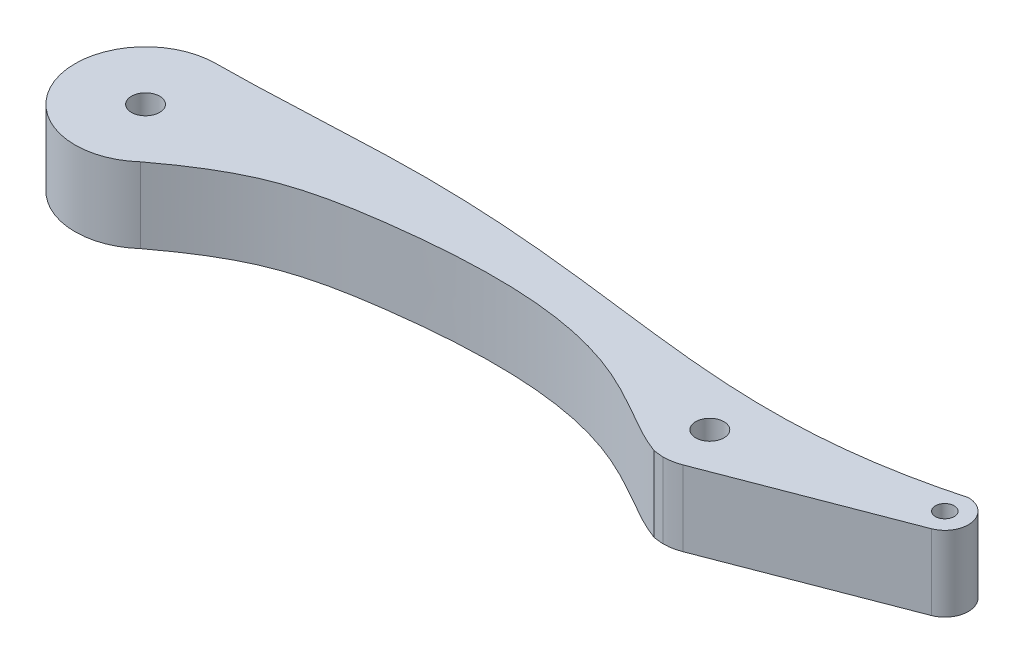
ISO-10303-21;
HEADER;
FILE_DESCRIPTION(('STEP AP214'),'2;1');
FILE_NAME('part.step','',(''),(''),'','','');
FILE_SCHEMA(('AUTOMOTIVE_DESIGN { 1 0 10303 214 1 1 1 1 }'));
ENDSEC;
DATA;
#1=APPLICATION_CONTEXT('core data for automotive mechanical design processes');
#2=APPLICATION_PROTOCOL_DEFINITION('international standard','automotive_design',2000,#1);
#3=PRODUCT_CONTEXT('',#1,'mechanical');
#4=PRODUCT('Part','Part','',(#3));
#5=PRODUCT_RELATED_PRODUCT_CATEGORY('part','',(#4));
#6=PRODUCT_DEFINITION_FORMATION('','',#4);
#7=PRODUCT_DEFINITION_CONTEXT('part definition',#1,'design');
#8=PRODUCT_DEFINITION('design','',#6,#7);
#9=PRODUCT_DEFINITION_SHAPE('','',#8);
#10=(LENGTH_UNIT() NAMED_UNIT(*) SI_UNIT(.MILLI.,.METRE.));
#11=(NAMED_UNIT(*) PLANE_ANGLE_UNIT() SI_UNIT($,.RADIAN.));
#12=(NAMED_UNIT(*) SI_UNIT($,.STERADIAN.) SOLID_ANGLE_UNIT());
#13=UNCERTAINTY_MEASURE_WITH_UNIT(LENGTH_MEASURE(1.E-05),#10,'distance_accuracy_value','');
#14=(GEOMETRIC_REPRESENTATION_CONTEXT(3) GLOBAL_UNCERTAINTY_ASSIGNED_CONTEXT((#13)) GLOBAL_UNIT_ASSIGNED_CONTEXT((#10,
#11,#12)) REPRESENTATION_CONTEXT('',''));
#15=CARTESIAN_POINT('',(0.,0.,0.));
#16=DIRECTION('',(0.,0.,1.));
#17=DIRECTION('',(1.,0.,0.));
#18=AXIS2_PLACEMENT_3D('',#15,#16,#17);
#19=CARTESIAN_POINT('',(0.,8.,-7.5));
#20=CARTESIAN_POINT('',(6.59618739379903,8.,-7.53042618499185));
#21=CARTESIAN_POINT('',(41.0181532042921,8.,-10.2662820268828));
#22=CARTESIAN_POINT('',(57.4957136227641,8.,-1.43169155879023));
#23=CARTESIAN_POINT('',(79.9999926350941,8.,-7.52972858327825));
#24=B_SPLINE_CURVE_WITH_KNOTS('',3,(#19,#20,#21,#22,#23),.UNSPECIFIED.,.F.,.F.,(4,1,4),(0.,
0.213970645101802,1.),.UNSPECIFIED.);
#25=DIRECTION('',(0.,-1.,0.));
#26=VECTOR('',#25,1.);
#27=SURFACE_OF_LINEAR_EXTRUSION('',#24,#26);
#28=CARTESIAN_POINT('',(0.,0.,-7.5));
#29=CARTESIAN_POINT('',(6.59618739379903,0.,-7.53042618499185));
#30=CARTESIAN_POINT('',(41.0181532042921,0.,-10.2662820268828));
#31=CARTESIAN_POINT('',(57.4957136227641,0.,-1.43169155879023));
#32=CARTESIAN_POINT('',(79.9999926350941,0.,-7.52972858327825));
#33=B_SPLINE_CURVE_WITH_KNOTS('',3,(#28,#29,#30,#31,#32),.UNSPECIFIED.,.F.,.F.,(4,1,4),(0.,
0.213970645101802,1.),.UNSPECIFIED.);
#34=CARTESIAN_POINT('',(0.,0.,-7.49999999999999));
#35=VERTEX_POINT('',#34);
#36=CARTESIAN_POINT('',(79.999992635094,0.,-7.52972858327824));
#37=VERTEX_POINT('',#36);
#38=EDGE_CURVE('E144',#35,#37,#33,.T.);
#39=ORIENTED_EDGE('',*,*,#38,.F.);
#40=DIRECTION('',(0.,-1.,0.));
#41=VECTOR('',#40,1.);
#42=CARTESIAN_POINT('',(0.,8.,-7.49999999999999));
#43=LINE('',#42,#41);
#44=CARTESIAN_POINT('',(0.,8.,-7.49999999999999));
#45=VERTEX_POINT('',#44);
#46=EDGE_CURVE('E11',#45,#35,#43,.T.);
#47=ORIENTED_EDGE('',*,*,#46,.F.);
#48=CARTESIAN_POINT('',(79.999992635094,8.,-7.52972858327824));
#49=VERTEX_POINT('',#48);
#50=EDGE_CURVE('E185',#45,#49,#24,.T.);
#51=ORIENTED_EDGE('',*,*,#50,.T.);
#52=DIRECTION('',(0.,-1.,0.));
#53=VECTOR('',#52,1.);
#54=CARTESIAN_POINT('',(79.999992635094,8.,-7.52972858327824));
#55=LINE('',#54,#53);
#56=EDGE_CURVE('E93',#49,#37,#55,.T.);
#57=ORIENTED_EDGE('',*,*,#56,.T.);
#58=EDGE_LOOP('',(#39,#47,#51,#57));
#59=FACE_BOUND('',#58,.T.);
#60=ADVANCED_FACE('F44',(#59),#27,.T.);
#61=CARTESIAN_POINT('',(5.03731244492082,8.,5.55657118484465));
#62=CARTESIAN_POINT('',(8.0215715054593,8.,3.32285112044769));
#63=CARTESIAN_POINT('',(13.6358152084039,8.,-0.236701705320971));
#64=CARTESIAN_POINT('',(47.1128364124341,8.,-6.0862178555139));
#65=CARTESIAN_POINT('',(52.1283803955074,8.,2.37645542334605));
#66=CARTESIAN_POINT('',(58.9707228196847,8.,4.86318503205236));
#67=B_SPLINE_CURVE_WITH_KNOTS('',3,(#61,#62,#63,#64,#65,#66),.UNSPECIFIED.,.F.,.F.,(4,1,1,4),
(0.0206670520231245,0.119805518021766,0.217738812819453,1.),.UNSPECIFIED.);
#68=DIRECTION('',(0.,-1.,0.));
#69=VECTOR('',#68,1.);
#70=SURFACE_OF_LINEAR_EXTRUSION('',#67,#69);
#71=CARTESIAN_POINT('',(5.03731244492082,0.,5.55657118484465));
#72=CARTESIAN_POINT('',(8.0215715054593,0.,3.32285112044769));
#73=CARTESIAN_POINT('',(13.6358152084039,0.,-0.236701705320971));
#74=CARTESIAN_POINT('',(47.1128364124341,0.,-6.0862178555139));
#75=CARTESIAN_POINT('',(52.1283803955074,0.,2.37645542334605));
#76=CARTESIAN_POINT('',(58.9707228196847,0.,4.86318503205236));
#77=B_SPLINE_CURVE_WITH_KNOTS('',3,(#71,#72,#73,#74,#75,#76),.UNSPECIFIED.,.F.,.F.,(4,1,1,4),
(0.0206670520231245,0.119805518021766,0.217738812819453,1.),.UNSPECIFIED.);
#78=CARTESIAN_POINT('',(5.03731244492081,0.,5.55657118484464));
#79=VERTEX_POINT('',#78);
#80=CARTESIAN_POINT('',(58.9707228196847,0.,4.86318503205234));
#81=VERTEX_POINT('',#80);
#82=EDGE_CURVE('E150',#79,#81,#77,.T.);
#83=ORIENTED_EDGE('',*,*,#82,.T.);
#84=DIRECTION('',(0.,-1.,0.));
#85=VECTOR('',#84,1.);
#86=CARTESIAN_POINT('',(58.9707228196847,8.,4.86318503205234));
#87=LINE('',#86,#85);
#88=CARTESIAN_POINT('',(58.9707228196847,8.,4.86318503205234));
#89=VERTEX_POINT('',#88);
#90=EDGE_CURVE('E192',#89,#81,#87,.T.);
#91=ORIENTED_EDGE('',*,*,#90,.F.);
#92=CARTESIAN_POINT('',(5.03731244492081,8.,5.55657118484464));
#93=VERTEX_POINT('',#92);
#94=EDGE_CURVE('E101',#93,#89,#67,.T.);
#95=ORIENTED_EDGE('',*,*,#94,.F.);
#96=DIRECTION('',(0.,-1.,0.));
#97=VECTOR('',#96,1.);
#98=CARTESIAN_POINT('',(5.03731244492081,8.,5.55657118484464));
#99=LINE('',#98,#97);
#100=EDGE_CURVE('E54',#93,#79,#99,.T.);
#101=ORIENTED_EDGE('',*,*,#100,.T.);
#102=EDGE_LOOP('',(#83,#91,#95,#101));
#103=FACE_BOUND('',#102,.T.);
#104=ADVANCED_FACE('F200',(#103),#70,.F.);
#105=CARTESIAN_POINT('',(58.9707228196847,8.,4.86318503205232));
#106=CARTESIAN_POINT('',(58.9781403232572,8.,4.86320370724343));
#107=CARTESIAN_POINT('',(59.992575824296,8.,4.97025708409772));
#108=CARTESIAN_POINT('',(59.999992635094,8.,4.97027141672176));
#109=B_SPLINE_CURVE_WITH_KNOTS('',3,(#105,#106,#107,#108),.UNSPECIFIED.,.F.,.F.,(4,4),
(0.714198539813145,0.714487623139183),.UNSPECIFIED.);
#110=DIRECTION('',(0.,-1.,0.));
#111=VECTOR('',#110,1.);
#112=SURFACE_OF_LINEAR_EXTRUSION('',#109,#111);
#113=CARTESIAN_POINT('',(58.9707228196847,0.,4.86318503205232));
#114=CARTESIAN_POINT('',(58.9781403232572,0.,4.86320370724343));
#115=CARTESIAN_POINT('',(59.992575824296,0.,4.97025708409772));
#116=CARTESIAN_POINT('',(59.999992635094,0.,4.97027141672176));
#117=B_SPLINE_CURVE_WITH_KNOTS('',3,(#113,#114,#115,#116),.UNSPECIFIED.,.F.,.F.,(4,4),
(0.714198539813145,0.714487623139183),.UNSPECIFIED.);
#118=CARTESIAN_POINT('',(59.999992635094,0.,4.97027141672176));
#119=VERTEX_POINT('',#118);
#120=EDGE_CURVE('E159',#81,#119,#117,.T.);
#121=ORIENTED_EDGE('',*,*,#120,.T.);
#122=DIRECTION('',(0.,-1.,0.));
#123=VECTOR('',#122,1.);
#124=CARTESIAN_POINT('',(59.999992635094,8.,4.97027141672176));
#125=LINE('',#124,#123);
#126=CARTESIAN_POINT('',(59.999992635094,8.,4.97027141672176));
#127=VERTEX_POINT('',#126);
#128=EDGE_CURVE('E126',#127,#119,#125,.T.);
#129=ORIENTED_EDGE('',*,*,#128,.F.);
#130=EDGE_CURVE('E115',#89,#127,#109,.T.);
#131=ORIENTED_EDGE('',*,*,#130,.F.);
#132=ORIENTED_EDGE('',*,*,#90,.T.);
#133=EDGE_LOOP('',(#121,#129,#131,#132));
#134=FACE_BOUND('',#133,.T.);
#135=ADVANCED_FACE('F212',(#134),#112,.F.);
#136=CARTESIAN_POINT('',(59.999992635094,8.,-0.0297285832782379));
#137=DIRECTION('',(0.,-1.,0.));
#138=DIRECTION('',(0.,0.,-1.));
#139=AXIS2_PLACEMENT_3D('',#136,#137,#138);
#140=CYLINDRICAL_SURFACE('',#139,5.);
#141=CARTESIAN_POINT('',(59.999992635094,0.,-0.0297285832782379));
#142=DIRECTION('',(0.,1.,0.));
#143=DIRECTION('',(0.,0.,1.));
#144=AXIS2_PLACEMENT_3D('',#141,#142,#143);
#145=CIRCLE('',#144,5.);
#146=CARTESIAN_POINT('',(61.7919562780164,0.,4.63812598841144));
#147=VERTEX_POINT('',#146);
#148=EDGE_CURVE('E124',#119,#147,#145,.T.);
#149=ORIENTED_EDGE('',*,*,#148,.T.);
#150=DIRECTION('',(0.,-1.,0.));
#151=VECTOR('',#150,1.);
#152=CARTESIAN_POINT('',(61.7919562780164,8.,4.63812598841144));
#153=LINE('',#152,#151);
#154=CARTESIAN_POINT('',(61.7919562780164,8.,4.63812598841144));
#155=VERTEX_POINT('',#154);
#156=EDGE_CURVE('E121',#155,#147,#153,.T.);
#157=ORIENTED_EDGE('',*,*,#156,.F.);
#158=CARTESIAN_POINT('',(59.999992635094,8.,-0.0297285832782379));
#159=DIRECTION('',(0.,1.,0.));
#160=DIRECTION('',(0.,0.,1.));
#161=AXIS2_PLACEMENT_3D('',#158,#159,#160);
#162=CIRCLE('',#161,5.);
#163=EDGE_CURVE('E108',#127,#155,#162,.T.);
#164=ORIENTED_EDGE('',*,*,#163,.F.);
#165=ORIENTED_EDGE('',*,*,#128,.T.);
#166=EDGE_LOOP('',(#149,#157,#164,#165));
#167=FACE_BOUND('',#166,.T.);
#168=ADVANCED_FACE('F122',(#167),#140,.T.);
#169=CARTESIAN_POINT('',(9.48873683222016,8.,24.717043661447));
#170=DIRECTION('',(-0.358392728584484,0.,-0.933570914337935));
#171=DIRECTION('',(-0.933570914337935,0.,0.358392728584484));
#172=AXIS2_PLACEMENT_3D('',#169,#170,#171);
#173=PLANE('',#172);
#174=DIRECTION('',(0.933570914337935,0.,-0.358392728584484));
#175=VECTOR('',#174,1.);
#176=CARTESIAN_POINT('',(9.48873683222016,0.,24.717043661447));
#177=LINE('',#176,#175);
#178=CARTESIAN_POINT('',(80.8959744565552,0.,-2.6958012974334));
#179=VERTEX_POINT('',#178);
#180=EDGE_CURVE('E86',#147,#179,#177,.T.);
#181=ORIENTED_EDGE('',*,*,#180,.T.);
#182=DIRECTION('',(0.,-1.,0.));
#183=VECTOR('',#182,1.);
#184=CARTESIAN_POINT('',(80.8959744565552,8.,-2.6958012974334));
#185=LINE('',#184,#183);
#186=CARTESIAN_POINT('',(80.8959744565552,8.,-2.6958012974334));
#187=VERTEX_POINT('',#186);
#188=EDGE_CURVE('E127',#187,#179,#185,.T.);
#189=ORIENTED_EDGE('',*,*,#188,.F.);
#190=DIRECTION('',(0.933570914337935,0.,-0.358392728584484));
#191=VECTOR('',#190,1.);
#192=CARTESIAN_POINT('',(9.48873683222016,8.,24.717043661447));
#193=LINE('',#192,#191);
#194=EDGE_CURVE('E113',#155,#187,#193,.T.);
#195=ORIENTED_EDGE('',*,*,#194,.F.);
#196=ORIENTED_EDGE('',*,*,#156,.T.);
#197=EDGE_LOOP('',(#181,#189,#195,#196));
#198=FACE_BOUND('',#197,.T.);
#199=ADVANCED_FACE('F129',(#198),#173,.F.);
#200=CARTESIAN_POINT('',(59.999992635094,8.,-0.0297285832782379));
#201=DIRECTION('',(0.,-1.,0.));
#202=DIRECTION('',(0.,0.,-1.));
#203=AXIS2_PLACEMENT_3D('',#200,#201,#202);
#204=CYLINDRICAL_SURFACE('',#203,1.5);
#205=CARTESIAN_POINT('',(59.999992635094,8.,-0.0297285832782379));
#206=DIRECTION('',(0.,1.,0.));
#207=DIRECTION('',(0.,0.,1.));
#208=AXIS2_PLACEMENT_3D('',#205,#206,#207);
#209=CIRCLE('',#208,1.5);
#210=CARTESIAN_POINT('',(59.999992635094,8.,1.47027141672176));
#211=VERTEX_POINT('',#210);
#212=EDGE_CURVE('E133',#211,#211,#209,.T.);
#213=ORIENTED_EDGE('',*,*,#212,.T.);
#214=EDGE_LOOP('',(#213));
#215=FACE_BOUND('',#214,.T.);
#216=CARTESIAN_POINT('',(59.999992635094,0.,-0.0297285832782379));
#217=DIRECTION('',(0.,1.,0.));
#218=DIRECTION('',(0.,0.,1.));
#219=AXIS2_PLACEMENT_3D('',#216,#217,#218);
#220=CIRCLE('',#219,1.5);
#221=CARTESIAN_POINT('',(59.999992635094,0.,1.47027141672176));
#222=VERTEX_POINT('',#221);
#223=EDGE_CURVE('E177',#222,#222,#220,.T.);
#224=ORIENTED_EDGE('',*,*,#223,.F.);
#225=EDGE_LOOP('',(#224));
#226=FACE_BOUND('',#225,.T.);
#227=ADVANCED_FACE('F281',(#215,#226),#204,.F.);
#228=CARTESIAN_POINT('',(79.999992635094,8.,-5.02972858327824));
#229=DIRECTION('',(0.,-1.,0.));
#230=DIRECTION('',(0.,0.,-1.));
#231=AXIS2_PLACEMENT_3D('',#228,#229,#230);
#232=CYLINDRICAL_SURFACE('',#231,2.50000000000001);
#233=CARTESIAN_POINT('',(79.999992635094,0.,-5.02972858327824));
#234=DIRECTION('',(0.,1.,0.));
#235=DIRECTION('',(0.,0.,1.));
#236=AXIS2_PLACEMENT_3D('',#233,#234,#235);
#237=CIRCLE('',#236,2.50000000000001);
#238=EDGE_CURVE('E174',#179,#37,#237,.T.);
#239=ORIENTED_EDGE('',*,*,#238,.T.);
#240=ORIENTED_EDGE('',*,*,#56,.F.);
#241=CARTESIAN_POINT('',(79.999992635094,8.,-5.02972858327824));
#242=DIRECTION('',(0.,1.,0.));
#243=DIRECTION('',(0.,0.,1.));
#244=AXIS2_PLACEMENT_3D('',#241,#242,#243);
#245=CIRCLE('',#244,2.50000000000001);
#246=EDGE_CURVE('E62',#187,#49,#245,.T.);
#247=ORIENTED_EDGE('',*,*,#246,.F.);
#248=ORIENTED_EDGE('',*,*,#188,.T.);
#249=EDGE_LOOP('',(#239,#240,#247,#248));
#250=FACE_BOUND('',#249,.T.);
#251=ADVANCED_FACE('F238',(#250),#232,.T.);
#252=CARTESIAN_POINT('',(79.999992635094,8.,-5.02972858327824));
#253=DIRECTION('',(0.,-1.,0.));
#254=DIRECTION('',(0.,0.,-1.));
#255=AXIS2_PLACEMENT_3D('',#252,#253,#254);
#256=CYLINDRICAL_SURFACE('',#255,0.999999999999998);
#257=CARTESIAN_POINT('',(79.999992635094,8.,-5.02972858327824));
#258=DIRECTION('',(0.,1.,0.));
#259=DIRECTION('',(0.,0.,1.));
#260=AXIS2_PLACEMENT_3D('',#257,#258,#259);
#261=CIRCLE('',#260,0.999999999999998);
#262=CARTESIAN_POINT('',(79.999992635094,8.,-4.02972858327824));
#263=VERTEX_POINT('',#262);
#264=EDGE_CURVE('E140',#263,#263,#261,.T.);
#265=ORIENTED_EDGE('',*,*,#264,.T.);
#266=EDGE_LOOP('',(#265));
#267=FACE_BOUND('',#266,.T.);
#268=CARTESIAN_POINT('',(79.999992635094,0.,-5.02972858327824));
#269=DIRECTION('',(0.,1.,0.));
#270=DIRECTION('',(0.,0.,1.));
#271=AXIS2_PLACEMENT_3D('',#268,#269,#270);
#272=CIRCLE('',#271,0.999999999999998);
#273=CARTESIAN_POINT('',(79.999992635094,0.,-4.02972858327824));
#274=VERTEX_POINT('',#273);
#275=EDGE_CURVE('E181',#274,#274,#272,.T.);
#276=ORIENTED_EDGE('',*,*,#275,.F.);
#277=EDGE_LOOP('',(#276));
#278=FACE_BOUND('',#277,.T.);
#279=ADVANCED_FACE('F269',(#267,#278),#256,.F.);
#280=CARTESIAN_POINT('',(0.,8.,0.));
#281=DIRECTION('',(0.,1.,0.));
#282=DIRECTION('',(0.,0.,1.));
#283=AXIS2_PLACEMENT_3D('',#280,#281,#282);
#284=PLANE('',#283);
#285=CARTESIAN_POINT('',(0.,8.,0.));
#286=DIRECTION('',(0.,1.,0.));
#287=DIRECTION('',(0.,0.,1.));
#288=AXIS2_PLACEMENT_3D('',#285,#286,#287);
#289=CIRCLE('',#288,1.5);
#290=CARTESIAN_POINT('',(0.,8.,1.5));
#291=VERTEX_POINT('',#290);
#292=EDGE_CURVE('E252',#291,#291,#289,.T.);
#293=ORIENTED_EDGE('',*,*,#292,.F.);
#294=EDGE_LOOP('',(#293));
#295=FACE_BOUND('',#294,.T.);
#296=ORIENTED_EDGE('',*,*,#50,.F.);
#297=CARTESIAN_POINT('',(0.,8.,0.));
#298=DIRECTION('',(0.,1.,0.));
#299=DIRECTION('',(0.,0.,1.));
#300=AXIS2_PLACEMENT_3D('',#297,#298,#299);
#301=CIRCLE('',#300,7.49999999999999);
#302=EDGE_CURVE('E151',#45,#93,#301,.T.);
#303=ORIENTED_EDGE('',*,*,#302,.T.);
#304=ORIENTED_EDGE('',*,*,#94,.T.);
#305=ORIENTED_EDGE('',*,*,#130,.T.);
#306=ORIENTED_EDGE('',*,*,#163,.T.);
#307=ORIENTED_EDGE('',*,*,#194,.T.);
#308=ORIENTED_EDGE('',*,*,#246,.T.);
#309=EDGE_LOOP('',(#296,#303,#304,#305,#306,#307,#308));
#310=FACE_BOUND('',#309,.T.);
#311=ORIENTED_EDGE('',*,*,#212,.F.);
#312=EDGE_LOOP('',(#311));
#313=FACE_BOUND('',#312,.T.);
#314=ORIENTED_EDGE('',*,*,#264,.F.);
#315=EDGE_LOOP('',(#314));
#316=FACE_BOUND('',#315,.T.);
#317=ADVANCED_FACE('F110',(#295,#310,#313,#316),#284,.T.);
#318=CARTESIAN_POINT('',(0.,0.,0.));
#319=DIRECTION('',(0.,1.,0.));
#320=DIRECTION('',(0.,0.,1.));
#321=AXIS2_PLACEMENT_3D('',#318,#319,#320);
#322=PLANE('',#321);
#323=CARTESIAN_POINT('',(0.,0.,0.));
#324=DIRECTION('',(0.,1.,0.));
#325=DIRECTION('',(0.,0.,1.));
#326=AXIS2_PLACEMENT_3D('',#323,#324,#325);
#327=CIRCLE('',#326,1.5);
#328=CARTESIAN_POINT('',(0.,0.,1.5));
#329=VERTEX_POINT('',#328);
#330=EDGE_CURVE('E249',#329,#329,#327,.T.);
#331=ORIENTED_EDGE('',*,*,#330,.T.);
#332=EDGE_LOOP('',(#331));
#333=FACE_BOUND('',#332,.T.);
#334=ORIENTED_EDGE('',*,*,#38,.T.);
#335=ORIENTED_EDGE('',*,*,#238,.F.);
#336=ORIENTED_EDGE('',*,*,#180,.F.);
#337=ORIENTED_EDGE('',*,*,#148,.F.);
#338=ORIENTED_EDGE('',*,*,#120,.F.);
#339=ORIENTED_EDGE('',*,*,#82,.F.);
#340=CARTESIAN_POINT('',(0.,0.,0.));
#341=DIRECTION('',(0.,1.,0.));
#342=DIRECTION('',(0.,0.,1.));
#343=AXIS2_PLACEMENT_3D('',#340,#341,#342);
#344=CIRCLE('',#343,7.49999999999999);
#345=EDGE_CURVE('E210',#35,#79,#344,.T.);
#346=ORIENTED_EDGE('',*,*,#345,.F.);
#347=EDGE_LOOP('',(#334,#335,#336,#337,#338,#339,#346));
#348=FACE_BOUND('',#347,.T.);
#349=ORIENTED_EDGE('',*,*,#223,.T.);
#350=EDGE_LOOP('',(#349));
#351=FACE_BOUND('',#350,.T.);
#352=ORIENTED_EDGE('',*,*,#275,.T.);
#353=EDGE_LOOP('',(#352));
#354=FACE_BOUND('',#353,.T.);
#355=ADVANCED_FACE('F208',(#333,#348,#351,#354),#322,.F.);
#356=CARTESIAN_POINT('',(0.,8.,0.));
#357=DIRECTION('',(0.,-1.,0.));
#358=DIRECTION('',(0.,0.,-1.));
#359=AXIS2_PLACEMENT_3D('',#356,#357,#358);
#360=CYLINDRICAL_SURFACE('',#359,7.49999999999999);
#361=ORIENTED_EDGE('',*,*,#46,.T.);
#362=ORIENTED_EDGE('',*,*,#345,.T.);
#363=ORIENTED_EDGE('',*,*,#100,.F.);
#364=ORIENTED_EDGE('',*,*,#302,.F.);
#365=EDGE_LOOP('',(#361,#362,#363,#364));
#366=FACE_BOUND('',#365,.T.);
#367=ADVANCED_FACE('F264',(#366),#360,.T.);
#368=CARTESIAN_POINT('',(0.,0.,0.));
#369=DIRECTION('',(0.,1.,0.));
#370=DIRECTION('',(0.,0.,1.));
#371=AXIS2_PLACEMENT_3D('',#368,#369,#370);
#372=CYLINDRICAL_SURFACE('',#371,1.5);
#373=ORIENTED_EDGE('',*,*,#330,.F.);
#374=EDGE_LOOP('',(#373));
#375=FACE_BOUND('',#374,.T.);
#376=ORIENTED_EDGE('',*,*,#292,.T.);
#377=EDGE_LOOP('',(#376));
#378=FACE_BOUND('',#377,.T.);
#379=ADVANCED_FACE('F261',(#375,#378),#372,.F.);
#380=CLOSED_SHELL('',(#60,#104,#135,#168,#199,#227,#251,#279,#317,#355,#367,#379));
#381=MANIFOLD_SOLID_BREP('B2',#380);
#382=ADVANCED_BREP_SHAPE_REPRESENTATION('',(#18,#381),#14);
#383=SHAPE_DEFINITION_REPRESENTATION(#9,#382);
ENDSEC;
END-ISO-10303-21;
